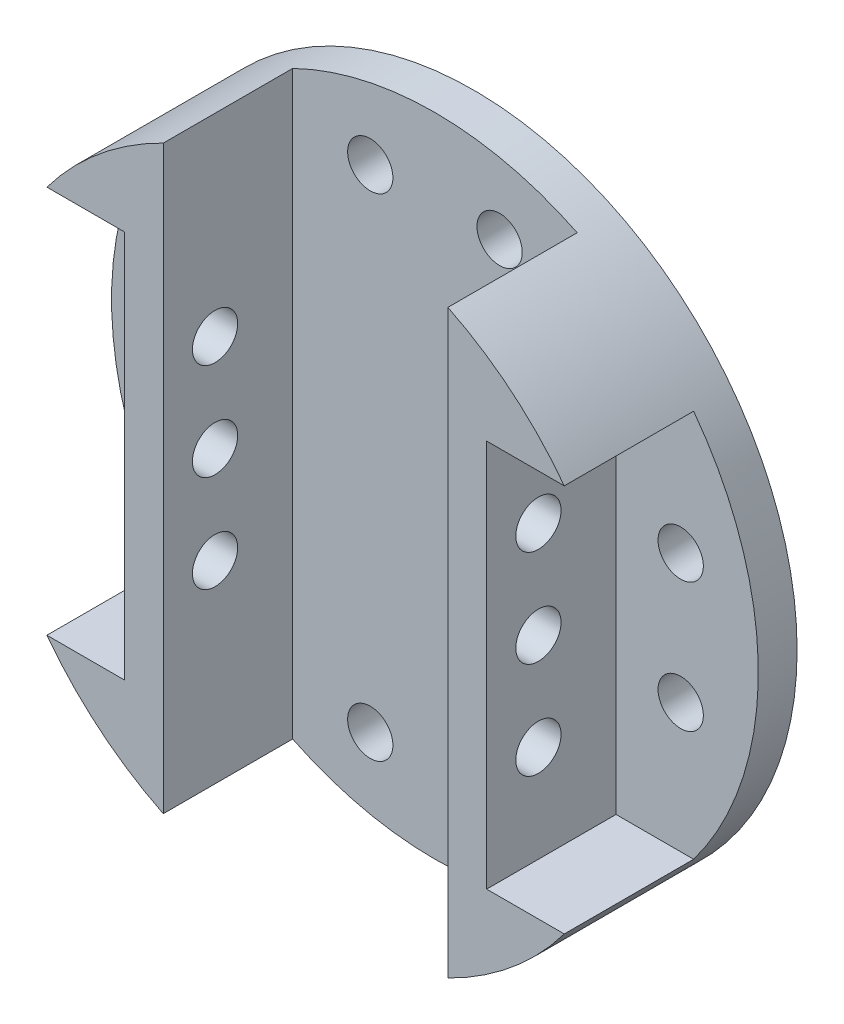
ISO-10303-21;
HEADER;
FILE_DESCRIPTION(('STEP AP214'),'2;1');
FILE_NAME('part.step','',(''),(''),'','','');
FILE_SCHEMA(('AUTOMOTIVE_DESIGN { 1 0 10303 214 1 1 1 1 }'));
ENDSEC;
DATA;
#1=APPLICATION_CONTEXT('core data for automotive mechanical design processes');
#2=APPLICATION_PROTOCOL_DEFINITION('international standard','automotive_design',2000,#1);
#3=PRODUCT_CONTEXT('',#1,'mechanical');
#4=PRODUCT('Part','Part','',(#3));
#5=PRODUCT_RELATED_PRODUCT_CATEGORY('part','',(#4));
#6=PRODUCT_DEFINITION_FORMATION('','',#4);
#7=PRODUCT_DEFINITION_CONTEXT('part definition',#1,'design');
#8=PRODUCT_DEFINITION('design','',#6,#7);
#9=PRODUCT_DEFINITION_SHAPE('','',#8);
#10=(LENGTH_UNIT() NAMED_UNIT(*) SI_UNIT(.MILLI.,.METRE.));
#11=(NAMED_UNIT(*) PLANE_ANGLE_UNIT() SI_UNIT($,.RADIAN.));
#12=(NAMED_UNIT(*) SI_UNIT($,.STERADIAN.) SOLID_ANGLE_UNIT());
#13=UNCERTAINTY_MEASURE_WITH_UNIT(LENGTH_MEASURE(1.E-05),#10,'distance_accuracy_value','');
#14=(GEOMETRIC_REPRESENTATION_CONTEXT(3) GLOBAL_UNCERTAINTY_ASSIGNED_CONTEXT((#13)) GLOBAL_UNIT_ASSIGNED_CONTEXT((#10,
#11,#12)) REPRESENTATION_CONTEXT('',''));
#15=CARTESIAN_POINT('',(0.,0.,0.));
#16=DIRECTION('',(0.,0.,1.));
#17=DIRECTION('',(1.,0.,0.));
#18=AXIS2_PLACEMENT_3D('',#15,#16,#17);
#19=CARTESIAN_POINT('',(0.,0.,13.));
#20=DIRECTION('',(0.,0.,1.));
#21=DIRECTION('',(1.,0.,0.));
#22=AXIS2_PLACEMENT_3D('',#19,#20,#21);
#23=PLANE('',#22);
#24=DIRECTION('',(-1.,0.,0.));
#25=VECTOR('',#24,1.);
#26=CARTESIAN_POINT('',(0.,15.,13.));
#27=LINE('',#26,#25);
#28=CARTESIAN_POINT('',(20.,15.,13.));
#29=VERTEX_POINT('',#28);
#30=CARTESIAN_POINT('',(14.,15.,13.));
#31=VERTEX_POINT('',#30);
#32=EDGE_CURVE('E129',#29,#31,#27,.T.);
#33=ORIENTED_EDGE('',*,*,#32,.F.);
#34=CARTESIAN_POINT('',(0.,0.,13.));
#35=DIRECTION('',(0.,0.,1.));
#36=DIRECTION('',(1.,0.,0.));
#37=AXIS2_PLACEMENT_3D('',#34,#35,#36);
#38=CIRCLE('',#37,25.);
#39=CARTESIAN_POINT('',(11.,22.4499443206436,13.));
#40=VERTEX_POINT('',#39);
#41=EDGE_CURVE('E204',#29,#40,#38,.T.);
#42=ORIENTED_EDGE('',*,*,#41,.T.);
#43=DIRECTION('',(0.,1.,0.));
#44=VECTOR('',#43,1.);
#45=CARTESIAN_POINT('',(11.,0.,13.));
#46=LINE('',#45,#44);
#47=CARTESIAN_POINT('',(11.,-22.4499443206436,13.));
#48=VERTEX_POINT('',#47);
#49=EDGE_CURVE('E140',#48,#40,#46,.T.);
#50=ORIENTED_EDGE('',*,*,#49,.F.);
#51=CARTESIAN_POINT('',(20.,-15.,13.));
#52=VERTEX_POINT('',#51);
#53=EDGE_CURVE('E208',#48,#52,#38,.T.);
#54=ORIENTED_EDGE('',*,*,#53,.T.);
#55=DIRECTION('',(1.,0.,0.));
#56=VECTOR('',#55,1.);
#57=CARTESIAN_POINT('',(36.,-15.,13.));
#58=LINE('',#57,#56);
#59=CARTESIAN_POINT('',(14.,-15.,13.));
#60=VERTEX_POINT('',#59);
#61=EDGE_CURVE('E149',#60,#52,#58,.T.);
#62=ORIENTED_EDGE('',*,*,#61,.F.);
#63=DIRECTION('',(0.,-1.,0.));
#64=VECTOR('',#63,1.);
#65=CARTESIAN_POINT('',(14.,15.,13.));
#66=LINE('',#65,#64);
#67=EDGE_CURVE('E62',#31,#60,#66,.T.);
#68=ORIENTED_EDGE('',*,*,#67,.F.);
#69=EDGE_LOOP('',(#33,#42,#50,#54,#62,#68));
#70=FACE_BOUND('',#69,.T.);
#71=ADVANCED_FACE('F37',(#70),#23,.T.);
#72=CARTESIAN_POINT('',(0.,0.,13.));
#73=DIRECTION('',(0.,0.,-1.));
#74=DIRECTION('',(-1.,0.,0.));
#75=AXIS2_PLACEMENT_3D('',#72,#73,#74);
#76=CYLINDRICAL_SURFACE('',#75,25.);
#77=CARTESIAN_POINT('',(-20.,-15.,13.));
#78=VERTEX_POINT('',#77);
#79=CARTESIAN_POINT('',(-11.,-22.4499443206437,13.));
#80=VERTEX_POINT('',#79);
#81=EDGE_CURVE('E266',#78,#80,#38,.T.);
#82=ORIENTED_EDGE('',*,*,#81,.F.);
#83=DIRECTION('',(0.,0.,-1.));
#84=VECTOR('',#83,1.);
#85=CARTESIAN_POINT('',(-20.,-15.,13.));
#86=LINE('',#85,#84);
#87=CARTESIAN_POINT('',(-20.,-15.,3.));
#88=VERTEX_POINT('',#87);
#89=EDGE_CURVE('E200',#78,#88,#86,.T.);
#90=ORIENTED_EDGE('',*,*,#89,.T.);
#91=CARTESIAN_POINT('',(0.,0.,3.));
#92=DIRECTION('',(0.,0.,1.));
#93=DIRECTION('',(1.,0.,0.));
#94=AXIS2_PLACEMENT_3D('',#91,#92,#93);
#95=CIRCLE('',#94,25.);
#96=CARTESIAN_POINT('',(-20.,15.,3.));
#97=VERTEX_POINT('',#96);
#98=EDGE_CURVE('E11',#97,#88,#95,.T.);
#99=ORIENTED_EDGE('',*,*,#98,.F.);
#100=DIRECTION('',(0.,0.,-1.));
#101=VECTOR('',#100,1.);
#102=CARTESIAN_POINT('',(-20.,15.,13.));
#103=LINE('',#102,#101);
#104=CARTESIAN_POINT('',(-20.,15.,13.));
#105=VERTEX_POINT('',#104);
#106=EDGE_CURVE('E197',#97,#105,#103,.F.);
#107=ORIENTED_EDGE('',*,*,#106,.T.);
#108=CARTESIAN_POINT('',(-11.,22.4499443206437,13.));
#109=VERTEX_POINT('',#108);
#110=EDGE_CURVE('E207',#109,#105,#38,.T.);
#111=ORIENTED_EDGE('',*,*,#110,.F.);
#112=DIRECTION('',(0.,0.,-1.));
#113=VECTOR('',#112,1.);
#114=CARTESIAN_POINT('',(-11.,22.4499443206436,13.));
#115=LINE('',#114,#113);
#116=CARTESIAN_POINT('',(-11.,22.4499443206437,3.));
#117=VERTEX_POINT('',#116);
#118=EDGE_CURVE('E184',#109,#117,#115,.T.);
#119=ORIENTED_EDGE('',*,*,#118,.T.);
#120=CARTESIAN_POINT('',(0.,0.,3.));
#121=DIRECTION('',(0.,0.,1.));
#122=DIRECTION('',(1.,0.,0.));
#123=AXIS2_PLACEMENT_3D('',#120,#121,#122);
#124=CIRCLE('',#123,25.);
#125=CARTESIAN_POINT('',(11.,22.4499443206436,3.));
#126=VERTEX_POINT('',#125);
#127=EDGE_CURVE('E216',#126,#117,#124,.T.);
#128=ORIENTED_EDGE('',*,*,#127,.F.);
#129=DIRECTION('',(0.,0.,-1.));
#130=VECTOR('',#129,1.);
#131=CARTESIAN_POINT('',(11.,22.4499443206436,13.));
#132=LINE('',#131,#130);
#133=EDGE_CURVE('E187',#126,#40,#132,.F.);
#134=ORIENTED_EDGE('',*,*,#133,.T.);
#135=ORIENTED_EDGE('',*,*,#41,.F.);
#136=DIRECTION('',(0.,0.,-1.));
#137=VECTOR('',#136,1.);
#138=CARTESIAN_POINT('',(20.,15.,13.));
#139=LINE('',#138,#137);
#140=CARTESIAN_POINT('',(20.,15.,3.));
#141=VERTEX_POINT('',#140);
#142=EDGE_CURVE('E135',#29,#141,#139,.T.);
#143=ORIENTED_EDGE('',*,*,#142,.T.);
#144=CARTESIAN_POINT('',(0.,0.,3.));
#145=DIRECTION('',(0.,0.,-1.));
#146=DIRECTION('',(-1.,0.,0.));
#147=AXIS2_PLACEMENT_3D('',#144,#145,#146);
#148=CIRCLE('',#147,25.);
#149=CARTESIAN_POINT('',(20.,-15.,3.));
#150=VERTEX_POINT('',#149);
#151=EDGE_CURVE('E46',#141,#150,#148,.T.);
#152=ORIENTED_EDGE('',*,*,#151,.T.);
#153=DIRECTION('',(0.,0.,-1.));
#154=VECTOR('',#153,1.);
#155=CARTESIAN_POINT('',(20.,-15.,13.));
#156=LINE('',#155,#154);
#157=EDGE_CURVE('E193',#150,#52,#156,.F.);
#158=ORIENTED_EDGE('',*,*,#157,.T.);
#159=ORIENTED_EDGE('',*,*,#53,.F.);
#160=DIRECTION('',(0.,0.,-1.));
#161=VECTOR('',#160,1.);
#162=CARTESIAN_POINT('',(11.,-22.4499443206436,13.));
#163=LINE('',#162,#161);
#164=CARTESIAN_POINT('',(11.,-22.4499443206436,3.));
#165=VERTEX_POINT('',#164);
#166=EDGE_CURVE('E190',#48,#165,#163,.T.);
#167=ORIENTED_EDGE('',*,*,#166,.T.);
#168=CARTESIAN_POINT('',(-11.,-22.4499443206437,3.));
#169=VERTEX_POINT('',#168);
#170=EDGE_CURVE('E214',#169,#165,#124,.T.);
#171=ORIENTED_EDGE('',*,*,#170,.F.);
#172=DIRECTION('',(0.,0.,-1.));
#173=VECTOR('',#172,1.);
#174=CARTESIAN_POINT('',(-11.,-22.4499443206436,13.));
#175=LINE('',#174,#173);
#176=EDGE_CURVE('E181',#169,#80,#175,.F.);
#177=ORIENTED_EDGE('',*,*,#176,.T.);
#178=EDGE_LOOP('',(#82,#90,#99,#107,#111,#119,#128,#134,#135,#143,#152,#158,#159,#167,#171,#177));
#179=FACE_BOUND('',#178,.T.);
#180=CARTESIAN_POINT('',(0.,0.,0.));
#181=DIRECTION('',(0.,0.,1.));
#182=DIRECTION('',(1.,0.,0.));
#183=AXIS2_PLACEMENT_3D('',#180,#181,#182);
#184=CIRCLE('',#183,25.);
#185=CARTESIAN_POINT('',(25.,0.,0.));
#186=VERTEX_POINT('',#185);
#187=EDGE_CURVE('E203',#186,#186,#184,.T.);
#188=ORIENTED_EDGE('',*,*,#187,.T.);
#189=EDGE_LOOP('',(#188));
#190=FACE_BOUND('',#189,.T.);
#191=ADVANCED_FACE('F39',(#179,#190),#76,.T.);
#192=DIRECTION('',(1.,0.,0.));
#193=VECTOR('',#192,1.);
#194=CARTESIAN_POINT('',(0.,-15.,13.));
#195=LINE('',#194,#193);
#196=CARTESIAN_POINT('',(-14.,-15.,13.));
#197=VERTEX_POINT('',#196);
#198=EDGE_CURVE('E139',#78,#197,#195,.T.);
#199=ORIENTED_EDGE('',*,*,#198,.F.);
#200=ORIENTED_EDGE('',*,*,#81,.T.);
#201=DIRECTION('',(0.,-1.,0.));
#202=VECTOR('',#201,1.);
#203=CARTESIAN_POINT('',(-11.,0.,13.));
#204=LINE('',#203,#202);
#205=EDGE_CURVE('E206',#109,#80,#204,.T.);
#206=ORIENTED_EDGE('',*,*,#205,.F.);
#207=ORIENTED_EDGE('',*,*,#110,.T.);
#208=DIRECTION('',(-1.,0.,0.));
#209=VECTOR('',#208,1.);
#210=CARTESIAN_POINT('',(-36.,15.,13.));
#211=LINE('',#210,#209);
#212=CARTESIAN_POINT('',(-14.,15.,13.));
#213=VERTEX_POINT('',#212);
#214=EDGE_CURVE('E169',#213,#105,#211,.T.);
#215=ORIENTED_EDGE('',*,*,#214,.F.);
#216=DIRECTION('',(0.,1.,0.));
#217=VECTOR('',#216,1.);
#218=CARTESIAN_POINT('',(-14.,15.,13.));
#219=LINE('',#218,#217);
#220=EDGE_CURVE('E54',#197,#213,#219,.T.);
#221=ORIENTED_EDGE('',*,*,#220,.F.);
#222=EDGE_LOOP('',(#199,#200,#206,#207,#215,#221));
#223=FACE_BOUND('',#222,.T.);
#224=ADVANCED_FACE('F274',(#223),#23,.T.);
#225=CARTESIAN_POINT('',(0.,0.,0.));
#226=DIRECTION('',(0.,0.,1.));
#227=DIRECTION('',(1.,0.,0.));
#228=AXIS2_PLACEMENT_3D('',#225,#226,#227);
#229=PLANE('',#228);
#230=CARTESIAN_POINT('',(19.,-5.,0.));
#231=DIRECTION('',(0.,0.,1.));
#232=DIRECTION('',(-1.,0.,0.));
#233=AXIS2_PLACEMENT_3D('',#230,#231,#232);
#234=CIRCLE('',#233,1.75);
#235=CARTESIAN_POINT('',(17.25,-5.,0.));
#236=VERTEX_POINT('',#235);
#237=EDGE_CURVE('E322',#236,#236,#234,.T.);
#238=ORIENTED_EDGE('',*,*,#237,.T.);
#239=EDGE_LOOP('',(#238));
#240=FACE_BOUND('',#239,.T.);
#241=CARTESIAN_POINT('',(5.,-19.,0.));
#242=DIRECTION('',(0.,0.,1.));
#243=DIRECTION('',(-1.,0.,0.));
#244=AXIS2_PLACEMENT_3D('',#241,#242,#243);
#245=CIRCLE('',#244,1.75);
#246=CARTESIAN_POINT('',(3.25,-19.,0.));
#247=VERTEX_POINT('',#246);
#248=EDGE_CURVE('E326',#247,#247,#245,.T.);
#249=ORIENTED_EDGE('',*,*,#248,.T.);
#250=EDGE_LOOP('',(#249));
#251=FACE_BOUND('',#250,.T.);
#252=CARTESIAN_POINT('',(19.,5.,0.));
#253=DIRECTION('',(0.,0.,-1.));
#254=DIRECTION('',(-1.,0.,0.));
#255=AXIS2_PLACEMENT_3D('',#252,#253,#254);
#256=CIRCLE('',#255,1.75);
#257=CARTESIAN_POINT('',(17.25,5.,0.));
#258=VERTEX_POINT('',#257);
#259=EDGE_CURVE('E330',#258,#258,#256,.T.);
#260=ORIENTED_EDGE('',*,*,#259,.F.);
#261=EDGE_LOOP('',(#260));
#262=FACE_BOUND('',#261,.T.);
#263=CARTESIAN_POINT('',(5.,19.,0.));
#264=DIRECTION('',(0.,0.,-1.));
#265=DIRECTION('',(-1.,0.,0.));
#266=AXIS2_PLACEMENT_3D('',#263,#264,#265);
#267=CIRCLE('',#266,1.75);
#268=CARTESIAN_POINT('',(3.25,19.,0.));
#269=VERTEX_POINT('',#268);
#270=EDGE_CURVE('E334',#269,#269,#267,.T.);
#271=ORIENTED_EDGE('',*,*,#270,.F.);
#272=EDGE_LOOP('',(#271));
#273=FACE_BOUND('',#272,.T.);
#274=CARTESIAN_POINT('',(-19.,-5.,0.));
#275=DIRECTION('',(0.,0.,-1.));
#276=DIRECTION('',(1.,0.,0.));
#277=AXIS2_PLACEMENT_3D('',#274,#275,#276);
#278=CIRCLE('',#277,1.75);
#279=CARTESIAN_POINT('',(-17.25,-5.,0.));
#280=VERTEX_POINT('',#279);
#281=EDGE_CURVE('E338',#280,#280,#278,.T.);
#282=ORIENTED_EDGE('',*,*,#281,.F.);
#283=EDGE_LOOP('',(#282));
#284=FACE_BOUND('',#283,.T.);
#285=CARTESIAN_POINT('',(-5.,-19.,0.));
#286=DIRECTION('',(0.,0.,-1.));
#287=DIRECTION('',(1.,0.,0.));
#288=AXIS2_PLACEMENT_3D('',#285,#286,#287);
#289=CIRCLE('',#288,1.75);
#290=CARTESIAN_POINT('',(-3.25,-19.,0.));
#291=VERTEX_POINT('',#290);
#292=EDGE_CURVE('E342',#291,#291,#289,.T.);
#293=ORIENTED_EDGE('',*,*,#292,.F.);
#294=EDGE_LOOP('',(#293));
#295=FACE_BOUND('',#294,.T.);
#296=CARTESIAN_POINT('',(-19.,5.,0.));
#297=DIRECTION('',(0.,0.,1.));
#298=DIRECTION('',(1.,0.,0.));
#299=AXIS2_PLACEMENT_3D('',#296,#297,#298);
#300=CIRCLE('',#299,1.75);
#301=CARTESIAN_POINT('',(-17.25,5.,0.));
#302=VERTEX_POINT('',#301);
#303=EDGE_CURVE('E222',#302,#302,#300,.T.);
#304=ORIENTED_EDGE('',*,*,#303,.T.);
#305=EDGE_LOOP('',(#304));
#306=FACE_BOUND('',#305,.T.);
#307=CARTESIAN_POINT('',(-5.,19.,0.));
#308=DIRECTION('',(0.,0.,1.));
#309=DIRECTION('',(1.,0.,0.));
#310=AXIS2_PLACEMENT_3D('',#307,#308,#309);
#311=CIRCLE('',#310,1.75);
#312=CARTESIAN_POINT('',(-3.25,19.,0.));
#313=VERTEX_POINT('',#312);
#314=EDGE_CURVE('E349',#313,#313,#311,.T.);
#315=ORIENTED_EDGE('',*,*,#314,.T.);
#316=EDGE_LOOP('',(#315));
#317=FACE_BOUND('',#316,.T.);
#318=ORIENTED_EDGE('',*,*,#187,.F.);
#319=EDGE_LOOP('',(#318));
#320=FACE_BOUND('',#319,.T.);
#321=ADVANCED_FACE('F303',(#240,#251,#262,#273,#284,#295,#306,#317,#320),#229,.F.);
#322=CARTESIAN_POINT('',(0.,0.,3.));
#323=DIRECTION('',(0.,0.,1.));
#324=DIRECTION('',(1.,0.,0.));
#325=AXIS2_PLACEMENT_3D('',#322,#323,#324);
#326=PLANE('',#325);
#327=CARTESIAN_POINT('',(5.,-19.,3.));
#328=DIRECTION('',(0.,0.,1.));
#329=DIRECTION('',(-1.,0.,0.));
#330=AXIS2_PLACEMENT_3D('',#327,#328,#329);
#331=CIRCLE('',#330,1.75);
#332=CARTESIAN_POINT('',(3.25,-19.,3.));
#333=VERTEX_POINT('',#332);
#334=EDGE_CURVE('E434',#333,#333,#331,.T.);
#335=ORIENTED_EDGE('',*,*,#334,.F.);
#336=EDGE_LOOP('',(#335));
#337=FACE_BOUND('',#336,.T.);
#338=CARTESIAN_POINT('',(5.,19.,3.));
#339=DIRECTION('',(0.,0.,-1.));
#340=DIRECTION('',(-1.,0.,0.));
#341=AXIS2_PLACEMENT_3D('',#338,#339,#340);
#342=CIRCLE('',#341,1.75);
#343=CARTESIAN_POINT('',(3.25,19.,3.));
#344=VERTEX_POINT('',#343);
#345=EDGE_CURVE('E426',#344,#344,#342,.T.);
#346=ORIENTED_EDGE('',*,*,#345,.T.);
#347=EDGE_LOOP('',(#346));
#348=FACE_BOUND('',#347,.T.);
#349=CARTESIAN_POINT('',(-5.,-19.,3.));
#350=DIRECTION('',(0.,0.,-1.));
#351=DIRECTION('',(1.,0.,0.));
#352=AXIS2_PLACEMENT_3D('',#349,#350,#351);
#353=CIRCLE('',#352,1.75);
#354=CARTESIAN_POINT('',(-3.25,-19.,3.));
#355=VERTEX_POINT('',#354);
#356=EDGE_CURVE('E421',#355,#355,#353,.T.);
#357=ORIENTED_EDGE('',*,*,#356,.T.);
#358=EDGE_LOOP('',(#357));
#359=FACE_BOUND('',#358,.T.);
#360=CARTESIAN_POINT('',(-5.,19.,3.));
#361=DIRECTION('',(0.,0.,1.));
#362=DIRECTION('',(1.,0.,0.));
#363=AXIS2_PLACEMENT_3D('',#360,#361,#362);
#364=CIRCLE('',#363,1.75);
#365=CARTESIAN_POINT('',(-3.25,19.,3.));
#366=VERTEX_POINT('',#365);
#367=EDGE_CURVE('E352',#366,#366,#364,.T.);
#368=ORIENTED_EDGE('',*,*,#367,.F.);
#369=EDGE_LOOP('',(#368));
#370=FACE_BOUND('',#369,.T.);
#371=DIRECTION('',(0.,1.,0.));
#372=VECTOR('',#371,1.);
#373=CARTESIAN_POINT('',(11.,25.,3.));
#374=LINE('',#373,#372);
#375=EDGE_CURVE('E150',#165,#126,#374,.T.);
#376=ORIENTED_EDGE('',*,*,#375,.T.);
#377=ORIENTED_EDGE('',*,*,#127,.T.);
#378=DIRECTION('',(0.,-1.,0.));
#379=VECTOR('',#378,1.);
#380=CARTESIAN_POINT('',(-11.,25.,3.));
#381=LINE('',#380,#379);
#382=EDGE_CURVE('E153',#117,#169,#381,.T.);
#383=ORIENTED_EDGE('',*,*,#382,.T.);
#384=ORIENTED_EDGE('',*,*,#170,.T.);
#385=EDGE_LOOP('',(#376,#377,#383,#384));
#386=FACE_BOUND('',#385,.T.);
#387=ADVANCED_FACE('F291',(#337,#348,#359,#370,#386),#326,.T.);
#388=CARTESIAN_POINT('',(11.,25.,3.));
#389=DIRECTION('',(1.,0.,0.));
#390=DIRECTION('',(0.,0.,-1.));
#391=AXIS2_PLACEMENT_3D('',#388,#389,#390);
#392=PLANE('',#391);
#393=CARTESIAN_POINT('',(11.,7.5,9.));
#394=DIRECTION('',(1.,0.,0.));
#395=DIRECTION('',(0.,0.,-1.));
#396=AXIS2_PLACEMENT_3D('',#393,#394,#395);
#397=CIRCLE('',#396,1.75);
#398=CARTESIAN_POINT('',(11.,7.5,7.25));
#399=VERTEX_POINT('',#398);
#400=EDGE_CURVE('E168',#399,#399,#397,.T.);
#401=ORIENTED_EDGE('',*,*,#400,.T.);
#402=EDGE_LOOP('',(#401));
#403=FACE_BOUND('',#402,.T.);
#404=CARTESIAN_POINT('',(11.,0.,9.));
#405=DIRECTION('',(1.,0.,0.));
#406=DIRECTION('',(0.,0.,-1.));
#407=AXIS2_PLACEMENT_3D('',#404,#405,#406);
#408=CIRCLE('',#407,1.75);
#409=CARTESIAN_POINT('',(11.,0.,7.25));
#410=VERTEX_POINT('',#409);
#411=EDGE_CURVE('E243',#410,#410,#408,.T.);
#412=ORIENTED_EDGE('',*,*,#411,.T.);
#413=EDGE_LOOP('',(#412));
#414=FACE_BOUND('',#413,.T.);
#415=CARTESIAN_POINT('',(11.,-7.5,9.));
#416=DIRECTION('',(1.,0.,0.));
#417=DIRECTION('',(0.,0.,-1.));
#418=AXIS2_PLACEMENT_3D('',#415,#416,#417);
#419=CIRCLE('',#418,1.75);
#420=CARTESIAN_POINT('',(11.,-7.5,7.25));
#421=VERTEX_POINT('',#420);
#422=EDGE_CURVE('E226',#421,#421,#419,.T.);
#423=ORIENTED_EDGE('',*,*,#422,.T.);
#424=EDGE_LOOP('',(#423));
#425=FACE_BOUND('',#424,.T.);
#426=ORIENTED_EDGE('',*,*,#49,.T.);
#427=ORIENTED_EDGE('',*,*,#133,.F.);
#428=ORIENTED_EDGE('',*,*,#375,.F.);
#429=ORIENTED_EDGE('',*,*,#166,.F.);
#430=EDGE_LOOP('',(#426,#427,#428,#429));
#431=FACE_BOUND('',#430,.T.);
#432=ADVANCED_FACE('F293',(#403,#414,#425,#431),#392,.F.);
#433=CARTESIAN_POINT('',(-11.,25.,3.));
#434=DIRECTION('',(-1.,0.,0.));
#435=DIRECTION('',(0.,0.,1.));
#436=AXIS2_PLACEMENT_3D('',#433,#434,#435);
#437=PLANE('',#436);
#438=CARTESIAN_POINT('',(-11.,7.5,9.));
#439=DIRECTION('',(-1.,0.,0.));
#440=DIRECTION('',(0.,0.,1.));
#441=AXIS2_PLACEMENT_3D('',#438,#439,#440);
#442=CIRCLE('',#441,1.75);
#443=CARTESIAN_POINT('',(-11.,7.5,10.75));
#444=VERTEX_POINT('',#443);
#445=EDGE_CURVE('E249',#444,#444,#442,.T.);
#446=ORIENTED_EDGE('',*,*,#445,.T.);
#447=EDGE_LOOP('',(#446));
#448=FACE_BOUND('',#447,.T.);
#449=CARTESIAN_POINT('',(-11.,0.,9.));
#450=DIRECTION('',(-1.,0.,0.));
#451=DIRECTION('',(0.,0.,1.));
#452=AXIS2_PLACEMENT_3D('',#449,#450,#451);
#453=CIRCLE('',#452,1.75);
#454=CARTESIAN_POINT('',(-11.,0.,10.75));
#455=VERTEX_POINT('',#454);
#456=EDGE_CURVE('E230',#455,#455,#453,.T.);
#457=ORIENTED_EDGE('',*,*,#456,.T.);
#458=EDGE_LOOP('',(#457));
#459=FACE_BOUND('',#458,.T.);
#460=CARTESIAN_POINT('',(-11.,-7.5,9.));
#461=DIRECTION('',(-1.,0.,0.));
#462=DIRECTION('',(0.,0.,1.));
#463=AXIS2_PLACEMENT_3D('',#460,#461,#462);
#464=CIRCLE('',#463,1.75);
#465=CARTESIAN_POINT('',(-11.,-7.5,10.75));
#466=VERTEX_POINT('',#465);
#467=EDGE_CURVE('E233',#466,#466,#464,.T.);
#468=ORIENTED_EDGE('',*,*,#467,.T.);
#469=EDGE_LOOP('',(#468));
#470=FACE_BOUND('',#469,.T.);
#471=ORIENTED_EDGE('',*,*,#205,.T.);
#472=ORIENTED_EDGE('',*,*,#176,.F.);
#473=ORIENTED_EDGE('',*,*,#382,.F.);
#474=ORIENTED_EDGE('',*,*,#118,.F.);
#475=EDGE_LOOP('',(#471,#472,#473,#474));
#476=FACE_BOUND('',#475,.T.);
#477=ADVANCED_FACE('F289',(#448,#459,#470,#476),#437,.F.);
#478=CARTESIAN_POINT('',(0.,0.,3.));
#479=DIRECTION('',(0.,0.,-1.));
#480=DIRECTION('',(-1.,0.,0.));
#481=AXIS2_PLACEMENT_3D('',#478,#479,#480);
#482=PLANE('',#481);
#483=CARTESIAN_POINT('',(19.,-5.,3.));
#484=DIRECTION('',(0.,0.,1.));
#485=DIRECTION('',(-1.,0.,0.));
#486=AXIS2_PLACEMENT_3D('',#483,#484,#485);
#487=CIRCLE('',#486,1.75);
#488=CARTESIAN_POINT('',(17.25,-5.,3.));
#489=VERTEX_POINT('',#488);
#490=EDGE_CURVE('E438',#489,#489,#487,.T.);
#491=ORIENTED_EDGE('',*,*,#490,.F.);
#492=EDGE_LOOP('',(#491));
#493=FACE_BOUND('',#492,.T.);
#494=CARTESIAN_POINT('',(19.,5.,3.));
#495=DIRECTION('',(0.,0.,-1.));
#496=DIRECTION('',(-1.,0.,0.));
#497=AXIS2_PLACEMENT_3D('',#494,#495,#496);
#498=CIRCLE('',#497,1.75);
#499=CARTESIAN_POINT('',(17.25,5.,3.));
#500=VERTEX_POINT('',#499);
#501=EDGE_CURVE('E430',#500,#500,#498,.T.);
#502=ORIENTED_EDGE('',*,*,#501,.T.);
#503=EDGE_LOOP('',(#502));
#504=FACE_BOUND('',#503,.T.);
#505=DIRECTION('',(-1.,0.,0.));
#506=VECTOR('',#505,1.);
#507=CARTESIAN_POINT('',(36.,15.,3.));
#508=LINE('',#507,#506);
#509=CARTESIAN_POINT('',(14.,15.,3.));
#510=VERTEX_POINT('',#509);
#511=EDGE_CURVE('E157',#141,#510,#508,.T.);
#512=ORIENTED_EDGE('',*,*,#511,.T.);
#513=DIRECTION('',(0.,-1.,0.));
#514=VECTOR('',#513,1.);
#515=CARTESIAN_POINT('',(14.,15.,3.));
#516=LINE('',#515,#514);
#517=CARTESIAN_POINT('',(14.,-15.,3.));
#518=VERTEX_POINT('',#517);
#519=EDGE_CURVE('E144',#510,#518,#516,.T.);
#520=ORIENTED_EDGE('',*,*,#519,.T.);
#521=DIRECTION('',(1.,0.,0.));
#522=VECTOR('',#521,1.);
#523=CARTESIAN_POINT('',(36.,-15.,3.));
#524=LINE('',#523,#522);
#525=EDGE_CURVE('E159',#518,#150,#524,.T.);
#526=ORIENTED_EDGE('',*,*,#525,.T.);
#527=ORIENTED_EDGE('',*,*,#151,.F.);
#528=EDGE_LOOP('',(#512,#520,#526,#527));
#529=FACE_BOUND('',#528,.T.);
#530=ADVANCED_FACE('F258',(#493,#504,#529),#482,.F.);
#531=CARTESIAN_POINT('',(36.,15.,3.));
#532=DIRECTION('',(0.,1.,0.));
#533=DIRECTION('',(0.,0.,1.));
#534=AXIS2_PLACEMENT_3D('',#531,#532,#533);
#535=PLANE('',#534);
#536=ORIENTED_EDGE('',*,*,#32,.T.);
#537=DIRECTION('',(0.,0.,1.));
#538=VECTOR('',#537,1.);
#539=CARTESIAN_POINT('',(14.,15.,3.));
#540=LINE('',#539,#538);
#541=EDGE_CURVE('E132',#510,#31,#540,.T.);
#542=ORIENTED_EDGE('',*,*,#541,.F.);
#543=ORIENTED_EDGE('',*,*,#511,.F.);
#544=ORIENTED_EDGE('',*,*,#142,.F.);
#545=EDGE_LOOP('',(#536,#542,#543,#544));
#546=FACE_BOUND('',#545,.T.);
#547=ADVANCED_FACE('F130',(#546),#535,.F.);
#548=CARTESIAN_POINT('',(36.,-15.,3.));
#549=DIRECTION('',(0.,-1.,0.));
#550=DIRECTION('',(0.,0.,-1.));
#551=AXIS2_PLACEMENT_3D('',#548,#549,#550);
#552=PLANE('',#551);
#553=ORIENTED_EDGE('',*,*,#525,.F.);
#554=DIRECTION('',(0.,0.,1.));
#555=VECTOR('',#554,1.);
#556=CARTESIAN_POINT('',(14.,-15.,3.));
#557=LINE('',#556,#555);
#558=EDGE_CURVE('E145',#518,#60,#557,.T.);
#559=ORIENTED_EDGE('',*,*,#558,.T.);
#560=ORIENTED_EDGE('',*,*,#61,.T.);
#561=ORIENTED_EDGE('',*,*,#157,.F.);
#562=EDGE_LOOP('',(#553,#559,#560,#561));
#563=FACE_BOUND('',#562,.T.);
#564=ADVANCED_FACE('F256',(#563),#552,.F.);
#565=CARTESIAN_POINT('',(14.,15.,3.));
#566=DIRECTION('',(-1.,0.,0.));
#567=DIRECTION('',(0.,0.,1.));
#568=AXIS2_PLACEMENT_3D('',#565,#566,#567);
#569=PLANE('',#568);
#570=CARTESIAN_POINT('',(14.,7.5,9.));
#571=DIRECTION('',(-1.,0.,0.));
#572=DIRECTION('',(0.,0.,1.));
#573=AXIS2_PLACEMENT_3D('',#570,#571,#572);
#574=CIRCLE('',#573,1.75);
#575=CARTESIAN_POINT('',(14.,7.5,10.75));
#576=VERTEX_POINT('',#575);
#577=EDGE_CURVE('E246',#576,#576,#574,.T.);
#578=ORIENTED_EDGE('',*,*,#577,.T.);
#579=EDGE_LOOP('',(#578));
#580=FACE_BOUND('',#579,.T.);
#581=CARTESIAN_POINT('',(14.,0.,9.));
#582=DIRECTION('',(-1.,0.,0.));
#583=DIRECTION('',(0.,0.,1.));
#584=AXIS2_PLACEMENT_3D('',#581,#582,#583);
#585=CIRCLE('',#584,1.75);
#586=CARTESIAN_POINT('',(14.,0.,10.75));
#587=VERTEX_POINT('',#586);
#588=EDGE_CURVE('E225',#587,#587,#585,.T.);
#589=ORIENTED_EDGE('',*,*,#588,.T.);
#590=EDGE_LOOP('',(#589));
#591=FACE_BOUND('',#590,.T.);
#592=CARTESIAN_POINT('',(14.,-7.5,9.));
#593=DIRECTION('',(-1.,0.,0.));
#594=DIRECTION('',(0.,0.,1.));
#595=AXIS2_PLACEMENT_3D('',#592,#593,#594);
#596=CIRCLE('',#595,1.75);
#597=CARTESIAN_POINT('',(14.,-7.5,10.75));
#598=VERTEX_POINT('',#597);
#599=EDGE_CURVE('E221',#598,#598,#596,.T.);
#600=ORIENTED_EDGE('',*,*,#599,.T.);
#601=EDGE_LOOP('',(#600));
#602=FACE_BOUND('',#601,.T.);
#603=ORIENTED_EDGE('',*,*,#67,.T.);
#604=ORIENTED_EDGE('',*,*,#558,.F.);
#605=ORIENTED_EDGE('',*,*,#519,.F.);
#606=ORIENTED_EDGE('',*,*,#541,.T.);
#607=EDGE_LOOP('',(#603,#604,#605,#606));
#608=FACE_BOUND('',#607,.T.);
#609=ADVANCED_FACE('F142',(#580,#591,#602,#608),#569,.F.);
#610=CARTESIAN_POINT('',(0.,0.,3.));
#611=DIRECTION('',(0.,0.,1.));
#612=DIRECTION('',(1.,0.,0.));
#613=AXIS2_PLACEMENT_3D('',#610,#611,#612);
#614=PLANE('',#613);
#615=CARTESIAN_POINT('',(-19.,-5.,3.));
#616=DIRECTION('',(0.,0.,-1.));
#617=DIRECTION('',(1.,0.,0.));
#618=AXIS2_PLACEMENT_3D('',#615,#616,#617);
#619=CIRCLE('',#618,1.75);
#620=CARTESIAN_POINT('',(-17.25,-5.,3.));
#621=VERTEX_POINT('',#620);
#622=EDGE_CURVE('E357',#621,#621,#619,.T.);
#623=ORIENTED_EDGE('',*,*,#622,.T.);
#624=EDGE_LOOP('',(#623));
#625=FACE_BOUND('',#624,.T.);
#626=CARTESIAN_POINT('',(-19.,5.,3.));
#627=DIRECTION('',(0.,0.,1.));
#628=DIRECTION('',(1.,0.,0.));
#629=AXIS2_PLACEMENT_3D('',#626,#627,#628);
#630=CIRCLE('',#629,1.75);
#631=CARTESIAN_POINT('',(-17.25,5.,3.));
#632=VERTEX_POINT('',#631);
#633=EDGE_CURVE('E355',#632,#632,#630,.T.);
#634=ORIENTED_EDGE('',*,*,#633,.F.);
#635=EDGE_LOOP('',(#634));
#636=FACE_BOUND('',#635,.T.);
#637=ORIENTED_EDGE('',*,*,#98,.T.);
#638=DIRECTION('',(1.,0.,0.));
#639=VECTOR('',#638,1.);
#640=CARTESIAN_POINT('',(-36.,-15.,3.));
#641=LINE('',#640,#639);
#642=CARTESIAN_POINT('',(-14.,-15.,3.));
#643=VERTEX_POINT('',#642);
#644=EDGE_CURVE('E165',#88,#643,#641,.T.);
#645=ORIENTED_EDGE('',*,*,#644,.T.);
#646=DIRECTION('',(0.,1.,0.));
#647=VECTOR('',#646,1.);
#648=CARTESIAN_POINT('',(-14.,15.,3.));
#649=LINE('',#648,#647);
#650=CARTESIAN_POINT('',(-14.,15.,3.));
#651=VERTEX_POINT('',#650);
#652=EDGE_CURVE('E171',#643,#651,#649,.T.);
#653=ORIENTED_EDGE('',*,*,#652,.T.);
#654=DIRECTION('',(-1.,0.,0.));
#655=VECTOR('',#654,1.);
#656=CARTESIAN_POINT('',(-36.,15.,3.));
#657=LINE('',#656,#655);
#658=EDGE_CURVE('E174',#651,#97,#657,.T.);
#659=ORIENTED_EDGE('',*,*,#658,.T.);
#660=EDGE_LOOP('',(#637,#645,#653,#659));
#661=FACE_BOUND('',#660,.T.);
#662=ADVANCED_FACE('F280',(#625,#636,#661),#614,.T.);
#663=CARTESIAN_POINT('',(-36.,-15.,3.));
#664=DIRECTION('',(0.,-1.,0.));
#665=DIRECTION('',(0.,0.,-1.));
#666=AXIS2_PLACEMENT_3D('',#663,#664,#665);
#667=PLANE('',#666);
#668=ORIENTED_EDGE('',*,*,#198,.T.);
#669=DIRECTION('',(0.,0.,1.));
#670=VECTOR('',#669,1.);
#671=CARTESIAN_POINT('',(-14.,-15.,3.));
#672=LINE('',#671,#670);
#673=EDGE_CURVE('E166',#643,#197,#672,.T.);
#674=ORIENTED_EDGE('',*,*,#673,.F.);
#675=ORIENTED_EDGE('',*,*,#644,.F.);
#676=ORIENTED_EDGE('',*,*,#89,.F.);
#677=EDGE_LOOP('',(#668,#674,#675,#676));
#678=FACE_BOUND('',#677,.T.);
#679=ADVANCED_FACE('F399',(#678),#667,.F.);
#680=CARTESIAN_POINT('',(-36.,15.,3.));
#681=DIRECTION('',(0.,1.,0.));
#682=DIRECTION('',(0.,0.,1.));
#683=AXIS2_PLACEMENT_3D('',#680,#681,#682);
#684=PLANE('',#683);
#685=ORIENTED_EDGE('',*,*,#658,.F.);
#686=DIRECTION('',(0.,0.,1.));
#687=VECTOR('',#686,1.);
#688=CARTESIAN_POINT('',(-14.,15.,3.));
#689=LINE('',#688,#687);
#690=EDGE_CURVE('E163',#651,#213,#689,.T.);
#691=ORIENTED_EDGE('',*,*,#690,.T.);
#692=ORIENTED_EDGE('',*,*,#214,.T.);
#693=ORIENTED_EDGE('',*,*,#106,.F.);
#694=EDGE_LOOP('',(#685,#691,#692,#693));
#695=FACE_BOUND('',#694,.T.);
#696=ADVANCED_FACE('F278',(#695),#684,.F.);
#697=CARTESIAN_POINT('',(-14.,15.,3.));
#698=DIRECTION('',(1.,0.,0.));
#699=DIRECTION('',(0.,0.,-1.));
#700=AXIS2_PLACEMENT_3D('',#697,#698,#699);
#701=PLANE('',#700);
#702=CARTESIAN_POINT('',(-14.,7.5,9.));
#703=DIRECTION('',(1.,0.,0.));
#704=DIRECTION('',(0.,0.,-1.));
#705=AXIS2_PLACEMENT_3D('',#702,#703,#704);
#706=CIRCLE('',#705,1.75);
#707=CARTESIAN_POINT('',(-14.,7.5,7.25));
#708=VERTEX_POINT('',#707);
#709=EDGE_CURVE('E41',#708,#708,#706,.T.);
#710=ORIENTED_EDGE('',*,*,#709,.T.);
#711=EDGE_LOOP('',(#710));
#712=FACE_BOUND('',#711,.T.);
#713=CARTESIAN_POINT('',(-14.,0.,9.));
#714=DIRECTION('',(1.,0.,0.));
#715=DIRECTION('',(0.,0.,-1.));
#716=AXIS2_PLACEMENT_3D('',#713,#714,#715);
#717=CIRCLE('',#716,1.75);
#718=CARTESIAN_POINT('',(-14.,0.,7.25));
#719=VERTEX_POINT('',#718);
#720=EDGE_CURVE('E223',#719,#719,#717,.T.);
#721=ORIENTED_EDGE('',*,*,#720,.T.);
#722=EDGE_LOOP('',(#721));
#723=FACE_BOUND('',#722,.T.);
#724=CARTESIAN_POINT('',(-14.,-7.5,9.));
#725=DIRECTION('',(1.,0.,0.));
#726=DIRECTION('',(0.,0.,-1.));
#727=AXIS2_PLACEMENT_3D('',#724,#725,#726);
#728=CIRCLE('',#727,1.75);
#729=CARTESIAN_POINT('',(-14.,-7.5,7.25));
#730=VERTEX_POINT('',#729);
#731=EDGE_CURVE('E219',#730,#730,#728,.T.);
#732=ORIENTED_EDGE('',*,*,#731,.T.);
#733=EDGE_LOOP('',(#732));
#734=FACE_BOUND('',#733,.T.);
#735=ORIENTED_EDGE('',*,*,#220,.T.);
#736=ORIENTED_EDGE('',*,*,#690,.F.);
#737=ORIENTED_EDGE('',*,*,#652,.F.);
#738=ORIENTED_EDGE('',*,*,#673,.T.);
#739=EDGE_LOOP('',(#735,#736,#737,#738));
#740=FACE_BOUND('',#739,.T.);
#741=ADVANCED_FACE('F284',(#712,#723,#734,#740),#701,.F.);
#742=CARTESIAN_POINT('',(-25.,-7.5,9.));
#743=DIRECTION('',(1.,0.,0.));
#744=DIRECTION('',(0.,0.,-1.));
#745=AXIS2_PLACEMENT_3D('',#742,#743,#744);
#746=CYLINDRICAL_SURFACE('',#745,1.75);
#747=ORIENTED_EDGE('',*,*,#731,.F.);
#748=EDGE_LOOP('',(#747));
#749=FACE_BOUND('',#748,.T.);
#750=ORIENTED_EDGE('',*,*,#467,.F.);
#751=EDGE_LOOP('',(#750));
#752=FACE_BOUND('',#751,.T.);
#753=ADVANCED_FACE('F370',(#749,#752),#746,.F.);
#754=CARTESIAN_POINT('',(-25.,0.,9.));
#755=DIRECTION('',(1.,0.,0.));
#756=DIRECTION('',(0.,0.,-1.));
#757=AXIS2_PLACEMENT_3D('',#754,#755,#756);
#758=CYLINDRICAL_SURFACE('',#757,1.75);
#759=ORIENTED_EDGE('',*,*,#720,.F.);
#760=EDGE_LOOP('',(#759));
#761=FACE_BOUND('',#760,.T.);
#762=ORIENTED_EDGE('',*,*,#456,.F.);
#763=EDGE_LOOP('',(#762));
#764=FACE_BOUND('',#763,.T.);
#765=ADVANCED_FACE('F378',(#761,#764),#758,.F.);
#766=CARTESIAN_POINT('',(-25.,7.5,9.));
#767=DIRECTION('',(1.,0.,0.));
#768=DIRECTION('',(0.,0.,-1.));
#769=AXIS2_PLACEMENT_3D('',#766,#767,#768);
#770=CYLINDRICAL_SURFACE('',#769,1.75);
#771=ORIENTED_EDGE('',*,*,#709,.F.);
#772=EDGE_LOOP('',(#771));
#773=FACE_BOUND('',#772,.T.);
#774=ORIENTED_EDGE('',*,*,#445,.F.);
#775=EDGE_LOOP('',(#774));
#776=FACE_BOUND('',#775,.T.);
#777=ADVANCED_FACE('F368',(#773,#776),#770,.F.);
#778=ORIENTED_EDGE('',*,*,#599,.F.);
#779=EDGE_LOOP('',(#778));
#780=FACE_BOUND('',#779,.T.);
#781=ORIENTED_EDGE('',*,*,#422,.F.);
#782=EDGE_LOOP('',(#781));
#783=FACE_BOUND('',#782,.T.);
#784=ADVANCED_FACE('F364',(#780,#783),#746,.F.);
#785=ORIENTED_EDGE('',*,*,#588,.F.);
#786=EDGE_LOOP('',(#785));
#787=FACE_BOUND('',#786,.T.);
#788=ORIENTED_EDGE('',*,*,#411,.F.);
#789=EDGE_LOOP('',(#788));
#790=FACE_BOUND('',#789,.T.);
#791=ADVANCED_FACE('F367',(#787,#790),#758,.F.);
#792=ORIENTED_EDGE('',*,*,#577,.F.);
#793=EDGE_LOOP('',(#792));
#794=FACE_BOUND('',#793,.T.);
#795=ORIENTED_EDGE('',*,*,#400,.F.);
#796=EDGE_LOOP('',(#795));
#797=FACE_BOUND('',#796,.T.);
#798=ADVANCED_FACE('F375',(#794,#797),#770,.F.);
#799=CARTESIAN_POINT('',(-19.,5.,0.));
#800=DIRECTION('',(0.,0.,1.));
#801=DIRECTION('',(1.,0.,0.));
#802=AXIS2_PLACEMENT_3D('',#799,#800,#801);
#803=CYLINDRICAL_SURFACE('',#802,1.75);
#804=ORIENTED_EDGE('',*,*,#303,.F.);
#805=EDGE_LOOP('',(#804));
#806=FACE_BOUND('',#805,.T.);
#807=ORIENTED_EDGE('',*,*,#633,.T.);
#808=EDGE_LOOP('',(#807));
#809=FACE_BOUND('',#808,.T.);
#810=ADVANCED_FACE('F472',(#806,#809),#803,.F.);
#811=CARTESIAN_POINT('',(-5.,19.,0.));
#812=DIRECTION('',(0.,0.,1.));
#813=DIRECTION('',(1.,0.,0.));
#814=AXIS2_PLACEMENT_3D('',#811,#812,#813);
#815=CYLINDRICAL_SURFACE('',#814,1.75);
#816=ORIENTED_EDGE('',*,*,#314,.F.);
#817=EDGE_LOOP('',(#816));
#818=FACE_BOUND('',#817,.T.);
#819=ORIENTED_EDGE('',*,*,#367,.T.);
#820=EDGE_LOOP('',(#819));
#821=FACE_BOUND('',#820,.T.);
#822=ADVANCED_FACE('F469',(#818,#821),#815,.F.);
#823=CARTESIAN_POINT('',(-19.,-5.,0.));
#824=DIRECTION('',(0.,0.,1.));
#825=DIRECTION('',(1.,0.,0.));
#826=AXIS2_PLACEMENT_3D('',#823,#824,#825);
#827=CYLINDRICAL_SURFACE('',#826,1.75);
#828=ORIENTED_EDGE('',*,*,#281,.T.);
#829=EDGE_LOOP('',(#828));
#830=FACE_BOUND('',#829,.T.);
#831=ORIENTED_EDGE('',*,*,#622,.F.);
#832=EDGE_LOOP('',(#831));
#833=FACE_BOUND('',#832,.T.);
#834=ADVANCED_FACE('F461',(#830,#833),#827,.F.);
#835=CARTESIAN_POINT('',(-5.,-19.,0.));
#836=DIRECTION('',(0.,0.,1.));
#837=DIRECTION('',(1.,0.,0.));
#838=AXIS2_PLACEMENT_3D('',#835,#836,#837);
#839=CYLINDRICAL_SURFACE('',#838,1.75);
#840=ORIENTED_EDGE('',*,*,#292,.T.);
#841=EDGE_LOOP('',(#840));
#842=FACE_BOUND('',#841,.T.);
#843=ORIENTED_EDGE('',*,*,#356,.F.);
#844=EDGE_LOOP('',(#843));
#845=FACE_BOUND('',#844,.T.);
#846=ADVANCED_FACE('F452',(#842,#845),#839,.F.);
#847=CARTESIAN_POINT('',(19.,5.,0.));
#848=DIRECTION('',(0.,0.,1.));
#849=DIRECTION('',(1.,0.,0.));
#850=AXIS2_PLACEMENT_3D('',#847,#848,#849);
#851=CYLINDRICAL_SURFACE('',#850,1.75);
#852=ORIENTED_EDGE('',*,*,#259,.T.);
#853=EDGE_LOOP('',(#852));
#854=FACE_BOUND('',#853,.T.);
#855=ORIENTED_EDGE('',*,*,#501,.F.);
#856=EDGE_LOOP('',(#855));
#857=FACE_BOUND('',#856,.T.);
#858=ADVANCED_FACE('F449',(#854,#857),#851,.F.);
#859=CARTESIAN_POINT('',(5.,19.,0.));
#860=DIRECTION('',(0.,0.,1.));
#861=DIRECTION('',(1.,0.,0.));
#862=AXIS2_PLACEMENT_3D('',#859,#860,#861);
#863=CYLINDRICAL_SURFACE('',#862,1.75);
#864=ORIENTED_EDGE('',*,*,#270,.T.);
#865=EDGE_LOOP('',(#864));
#866=FACE_BOUND('',#865,.T.);
#867=ORIENTED_EDGE('',*,*,#345,.F.);
#868=EDGE_LOOP('',(#867));
#869=FACE_BOUND('',#868,.T.);
#870=ADVANCED_FACE('F451',(#866,#869),#863,.F.);
#871=CARTESIAN_POINT('',(19.,-5.,0.));
#872=DIRECTION('',(0.,0.,1.));
#873=DIRECTION('',(1.,0.,0.));
#874=AXIS2_PLACEMENT_3D('',#871,#872,#873);
#875=CYLINDRICAL_SURFACE('',#874,1.75);
#876=ORIENTED_EDGE('',*,*,#237,.F.);
#877=EDGE_LOOP('',(#876));
#878=FACE_BOUND('',#877,.T.);
#879=ORIENTED_EDGE('',*,*,#490,.T.);
#880=EDGE_LOOP('',(#879));
#881=FACE_BOUND('',#880,.T.);
#882=ADVANCED_FACE('F443',(#878,#881),#875,.F.);
#883=CARTESIAN_POINT('',(5.,-19.,0.));
#884=DIRECTION('',(0.,0.,1.));
#885=DIRECTION('',(1.,0.,0.));
#886=AXIS2_PLACEMENT_3D('',#883,#884,#885);
#887=CYLINDRICAL_SURFACE('',#886,1.75);
#888=ORIENTED_EDGE('',*,*,#248,.F.);
#889=EDGE_LOOP('',(#888));
#890=FACE_BOUND('',#889,.T.);
#891=ORIENTED_EDGE('',*,*,#334,.T.);
#892=EDGE_LOOP('',(#891));
#893=FACE_BOUND('',#892,.T.);
#894=ADVANCED_FACE('F465',(#890,#893),#887,.F.);
#895=CLOSED_SHELL('',(#71,#191,#224,#321,#387,#432,#477,#530,#547,#564,#609,#662,#679,#696,#741,
#753,#765,#777,#784,#791,#798,#810,#822,#834,#846,#858,#870,#882,#894));
#896=MANIFOLD_SOLID_BREP('B2',#895);
#897=ADVANCED_BREP_SHAPE_REPRESENTATION('',(#18,#896),#14);
#898=SHAPE_DEFINITION_REPRESENTATION(#9,#897);
ENDSEC;
END-ISO-10303-21;
